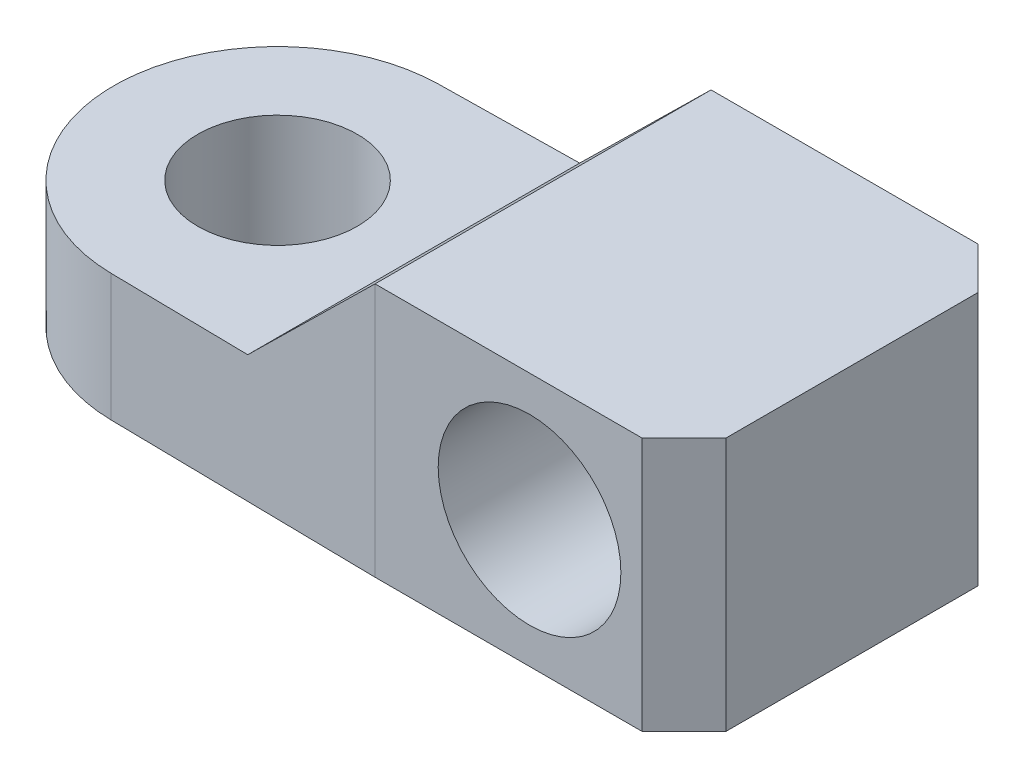
ISO-10303-21;
HEADER;
FILE_DESCRIPTION(('STEP AP214'),'2;1');
FILE_NAME('part.step','',(''),(''),'','','');
FILE_SCHEMA(('AUTOMOTIVE_DESIGN { 1 0 10303 214 1 1 1 1 }'));
ENDSEC;
DATA;
#1=APPLICATION_CONTEXT('core data for automotive mechanical design processes');
#2=APPLICATION_PROTOCOL_DEFINITION('international standard','automotive_design',2000,#1);
#3=PRODUCT_CONTEXT('',#1,'mechanical');
#4=PRODUCT('Part','Part','',(#3));
#5=PRODUCT_RELATED_PRODUCT_CATEGORY('part','',(#4));
#6=PRODUCT_DEFINITION_FORMATION('','',#4);
#7=PRODUCT_DEFINITION_CONTEXT('part definition',#1,'design');
#8=PRODUCT_DEFINITION('design','',#6,#7);
#9=PRODUCT_DEFINITION_SHAPE('','',#8);
#10=(LENGTH_UNIT() NAMED_UNIT(*) SI_UNIT(.MILLI.,.METRE.));
#11=(NAMED_UNIT(*) PLANE_ANGLE_UNIT() SI_UNIT($,.RADIAN.));
#12=(NAMED_UNIT(*) SI_UNIT($,.STERADIAN.) SOLID_ANGLE_UNIT());
#13=UNCERTAINTY_MEASURE_WITH_UNIT(LENGTH_MEASURE(1.E-05),#10,'distance_accuracy_value','');
#14=(GEOMETRIC_REPRESENTATION_CONTEXT(3) GLOBAL_UNCERTAINTY_ASSIGNED_CONTEXT((#13)) GLOBAL_UNIT_ASSIGNED_CONTEXT((#10,
#11,#12)) REPRESENTATION_CONTEXT('',''));
#15=CARTESIAN_POINT('',(0.,0.,0.));
#16=DIRECTION('',(0.,0.,1.));
#17=DIRECTION('',(1.,0.,0.));
#18=AXIS2_PLACEMENT_3D('',#15,#16,#17);
#19=CARTESIAN_POINT('',(-0.0613838784445087,6.05,-3.89951689565093));
#20=DIRECTION('',(-0.0157394560114125,0.,-0.999876127089983));
#21=DIRECTION('',(-0.999876127089984,0.,0.0157394560114125));
#22=AXIS2_PLACEMENT_3D('',#19,#20,#21);
#23=PLANE('',#22);
#24=DIRECTION('',(0.,-1.,0.));
#25=VECTOR('',#24,1.);
#26=CARTESIAN_POINT('',(-0.0613838784445082,6.05,-3.89951689565093));
#27=LINE('',#26,#25);
#28=CARTESIAN_POINT('',(-0.0613838784445082,3.025,-3.89951689565093));
#29=VERTEX_POINT('',#28);
#30=CARTESIAN_POINT('',(-0.0613838784445082,0.,-3.89951689565093));
#31=VERTEX_POINT('',#30);
#32=EDGE_CURVE('E179',#29,#31,#27,.T.);
#33=ORIENTED_EDGE('',*,*,#32,.F.);
#34=DIRECTION('',(0.999876127089984,0.,-0.0157394560114125));
#35=VECTOR('',#34,1.);
#36=CARTESIAN_POINT('',(-0.0613838784445087,3.025,-3.89951689565093));
#37=LINE('',#36,#35);
#38=CARTESIAN_POINT('',(3.2418601585521,3.025,-3.95151460097328));
#39=VERTEX_POINT('',#38);
#40=EDGE_CURVE('E141',#29,#39,#37,.T.);
#41=ORIENTED_EDGE('',*,*,#40,.T.);
#42=DIRECTION('',(0.713416670590464,0.700650081816092,-0.0112301814198194));
#43=VECTOR('',#42,1.);
#44=CARTESIAN_POINT('',(3.07227615816136,2.85845070469108,-3.94884511038132));
#45=LINE('',#44,#43);
#46=CARTESIAN_POINT('',(6.32197887193665,6.05,-3.99999999999999));
#47=VERTEX_POINT('',#46);
#48=EDGE_CURVE('E130',#39,#47,#45,.T.);
#49=ORIENTED_EDGE('',*,*,#48,.T.);
#50=DIRECTION('',(0.,-1.,0.));
#51=VECTOR('',#50,1.);
#52=CARTESIAN_POINT('',(6.32197887193665,6.05,-3.99999999999999));
#53=LINE('',#52,#51);
#54=CARTESIAN_POINT('',(6.32197887193665,0.,-3.99999999999999));
#55=VERTEX_POINT('',#54);
#56=EDGE_CURVE('E156',#47,#55,#53,.T.);
#57=ORIENTED_EDGE('',*,*,#56,.T.);
#58=DIRECTION('',(0.999876127089984,0.,-0.0157394560114125));
#59=VECTOR('',#58,1.);
#60=CARTESIAN_POINT('',(-0.0613838784445087,0.,-3.89951689565093));
#61=LINE('',#60,#59);
#62=EDGE_CURVE('E159',#31,#55,#61,.T.);
#63=ORIENTED_EDGE('',*,*,#62,.F.);
#64=EDGE_LOOP('',(#33,#41,#49,#57,#63));
#65=FACE_BOUND('',#64,.T.);
#66=ADVANCED_FACE('F38',(#65),#23,.T.);
#67=CARTESIAN_POINT('',(0.,6.05,0.));
#68=DIRECTION('',(0.,-1.,0.));
#69=DIRECTION('',(0.,0.,-1.));
#70=AXIS2_PLACEMENT_3D('',#67,#68,#69);
#71=CYLINDRICAL_SURFACE('',#70,3.9);
#72=CARTESIAN_POINT('',(0.,3.025,0.));
#73=DIRECTION('',(0.,1.,0.));
#74=DIRECTION('',(0.,0.,1.));
#75=AXIS2_PLACEMENT_3D('',#72,#73,#74);
#76=CIRCLE('',#75,3.9);
#77=CARTESIAN_POINT('',(-0.0613838784445082,3.025,3.89951689565094));
#78=VERTEX_POINT('',#77);
#79=EDGE_CURVE('E121',#29,#78,#76,.T.);
#80=ORIENTED_EDGE('',*,*,#79,.F.);
#81=ORIENTED_EDGE('',*,*,#32,.T.);
#82=CARTESIAN_POINT('',(0.,0.,0.));
#83=DIRECTION('',(0.,1.,0.));
#84=DIRECTION('',(0.,0.,1.));
#85=AXIS2_PLACEMENT_3D('',#82,#83,#84);
#86=CIRCLE('',#85,3.9);
#87=CARTESIAN_POINT('',(-0.0613838784445082,0.,3.89951689565094));
#88=VERTEX_POINT('',#87);
#89=EDGE_CURVE('E162',#31,#88,#86,.T.);
#90=ORIENTED_EDGE('',*,*,#89,.T.);
#91=DIRECTION('',(0.,-1.,0.));
#92=VECTOR('',#91,1.);
#93=CARTESIAN_POINT('',(-0.0613838784445082,6.05,3.89951689565094));
#94=LINE('',#93,#92);
#95=EDGE_CURVE('E177',#78,#88,#94,.T.);
#96=ORIENTED_EDGE('',*,*,#95,.F.);
#97=EDGE_LOOP('',(#80,#81,#90,#96));
#98=FACE_BOUND('',#97,.T.);
#99=ADVANCED_FACE('F228',(#98),#71,.T.);
#100=CARTESIAN_POINT('',(-0.0613838784445087,6.05,3.89951689565094));
#101=DIRECTION('',(-0.0157394560114125,0.,0.999876127089983));
#102=DIRECTION('',(0.999876127089984,0.,0.0157394560114125));
#103=AXIS2_PLACEMENT_3D('',#100,#101,#102);
#104=PLANE('',#103);
#105=DIRECTION('',(-0.713416670590464,-0.700650081816092,-0.0112301814198194));
#106=VECTOR('',#105,1.);
#107=CARTESIAN_POINT('',(3.07227615816136,2.85845070469108,3.94884511038132));
#108=LINE('',#107,#106);
#109=CARTESIAN_POINT('',(6.32197887193665,6.05,3.99999999999999));
#110=VERTEX_POINT('',#109);
#111=CARTESIAN_POINT('',(3.2418601585521,3.025,3.95151460097328));
#112=VERTEX_POINT('',#111);
#113=EDGE_CURVE('E128',#110,#112,#108,.T.);
#114=ORIENTED_EDGE('',*,*,#113,.T.);
#115=DIRECTION('',(-0.999876127089984,0.,-0.0157394560114125));
#116=VECTOR('',#115,1.);
#117=CARTESIAN_POINT('',(-0.0613838784445087,3.025,3.89951689565094));
#118=LINE('',#117,#116);
#119=EDGE_CURVE('E115',#112,#78,#118,.T.);
#120=ORIENTED_EDGE('',*,*,#119,.T.);
#121=ORIENTED_EDGE('',*,*,#95,.T.);
#122=DIRECTION('',(-0.999876127089984,0.,-0.0157394560114125));
#123=VECTOR('',#122,1.);
#124=CARTESIAN_POINT('',(-0.0613838784445087,0.,3.89951689565094));
#125=LINE('',#124,#123);
#126=CARTESIAN_POINT('',(6.32197887193665,0.,3.99999999999999));
#127=VERTEX_POINT('',#126);
#128=EDGE_CURVE('E165',#127,#88,#125,.T.);
#129=ORIENTED_EDGE('',*,*,#128,.F.);
#130=DIRECTION('',(0.,-1.,0.));
#131=VECTOR('',#130,1.);
#132=CARTESIAN_POINT('',(6.32197887193665,6.05,3.99999999999999));
#133=LINE('',#132,#131);
#134=EDGE_CURVE('E136',#110,#127,#133,.T.);
#135=ORIENTED_EDGE('',*,*,#134,.F.);
#136=EDGE_LOOP('',(#114,#120,#121,#129,#135));
#137=FACE_BOUND('',#136,.T.);
#138=ADVANCED_FACE('F133',(#137),#104,.T.);
#139=CARTESIAN_POINT('',(0.,6.05,0.));
#140=DIRECTION('',(0.,-1.,0.));
#141=DIRECTION('',(0.,0.,-1.));
#142=AXIS2_PLACEMENT_3D('',#139,#140,#141);
#143=CYLINDRICAL_SURFACE('',#142,1.9);
#144=CARTESIAN_POINT('',(0.,0.,0.));
#145=DIRECTION('',(0.,1.,0.));
#146=DIRECTION('',(0.,0.,1.));
#147=AXIS2_PLACEMENT_3D('',#144,#145,#146);
#148=CIRCLE('',#147,1.9);
#149=CARTESIAN_POINT('',(0.,0.,1.9));
#150=VERTEX_POINT('',#149);
#151=EDGE_CURVE('E147',#150,#150,#148,.T.);
#152=ORIENTED_EDGE('',*,*,#151,.F.);
#153=EDGE_LOOP('',(#152));
#154=FACE_BOUND('',#153,.T.);
#155=CARTESIAN_POINT('',(0.,3.025,0.));
#156=DIRECTION('',(0.,1.,0.));
#157=DIRECTION('',(0.,0.,1.));
#158=AXIS2_PLACEMENT_3D('',#155,#156,#157);
#159=CIRCLE('',#158,1.9);
#160=CARTESIAN_POINT('',(0.,3.025,1.9));
#161=VERTEX_POINT('',#160);
#162=EDGE_CURVE('E43',#161,#161,#159,.T.);
#163=ORIENTED_EDGE('',*,*,#162,.T.);
#164=EDGE_LOOP('',(#163));
#165=FACE_BOUND('',#164,.T.);
#166=ADVANCED_FACE('F237',(#154,#165),#143,.F.);
#167=CARTESIAN_POINT('',(0.,6.05,0.));
#168=DIRECTION('',(0.,1.,0.));
#169=DIRECTION('',(0.,0.,1.));
#170=AXIS2_PLACEMENT_3D('',#167,#168,#169);
#171=PLANE('',#170);
#172=DIRECTION('',(1.,0.,0.));
#173=VECTOR('',#172,1.);
#174=CARTESIAN_POINT('',(0.,6.05,-3.99999999999999));
#175=LINE('',#174,#173);
#176=CARTESIAN_POINT('',(12.6780211280634,6.05,-3.99999999999999));
#177=VERTEX_POINT('',#176);
#178=EDGE_CURVE('E154',#47,#177,#175,.T.);
#179=ORIENTED_EDGE('',*,*,#178,.F.);
#180=DIRECTION('',(0.,0.,1.));
#181=VECTOR('',#180,1.);
#182=CARTESIAN_POINT('',(6.32197887193664,6.05,0.));
#183=LINE('',#182,#181);
#184=EDGE_CURVE('E11',#47,#110,#183,.T.);
#185=ORIENTED_EDGE('',*,*,#184,.T.);
#186=DIRECTION('',(-1.,0.,0.));
#187=VECTOR('',#186,1.);
#188=CARTESIAN_POINT('',(0.,6.05,3.99999999999998));
#189=LINE('',#188,#187);
#190=CARTESIAN_POINT('',(12.6780211280633,6.05,4.00000000000001));
#191=VERTEX_POINT('',#190);
#192=EDGE_CURVE('E148',#191,#110,#189,.T.);
#193=ORIENTED_EDGE('',*,*,#192,.F.);
#194=DIRECTION('',(-0.707106781186551,0.,0.707106781186544));
#195=VECTOR('',#194,1.);
#196=CARTESIAN_POINT('',(8.33901056403162,6.05,8.3390105640317));
#197=LINE('',#196,#195);
#198=CARTESIAN_POINT('',(13.6780211280634,6.05,3.00000000000001));
#199=VERTEX_POINT('',#198);
#200=EDGE_CURVE('E194',#191,#199,#197,.F.);
#201=ORIENTED_EDGE('',*,*,#200,.T.);
#202=DIRECTION('',(0.,0.,1.));
#203=VECTOR('',#202,1.);
#204=CARTESIAN_POINT('',(13.6780211280634,6.05,0.));
#205=LINE('',#204,#203);
#206=CARTESIAN_POINT('',(13.6780211280634,6.05,-2.99999999999999));
#207=VERTEX_POINT('',#206);
#208=EDGE_CURVE('E150',#207,#199,#205,.T.);
#209=ORIENTED_EDGE('',*,*,#208,.F.);
#210=DIRECTION('',(0.707106781186546,0.,0.707106781186549));
#211=VECTOR('',#210,1.);
#212=CARTESIAN_POINT('',(8.33901056403169,6.05,-8.33901056403167));
#213=LINE('',#212,#211);
#214=EDGE_CURVE('E55',#207,#177,#213,.F.);
#215=ORIENTED_EDGE('',*,*,#214,.T.);
#216=EDGE_LOOP('',(#179,#185,#193,#201,#209,#215));
#217=FACE_BOUND('',#216,.T.);
#218=ADVANCED_FACE('F210',(#217),#171,.T.);
#219=CARTESIAN_POINT('',(0.,6.05,3.99999999999998));
#220=DIRECTION('',(0.,0.,1.));
#221=DIRECTION('',(1.,0.,0.));
#222=AXIS2_PLACEMENT_3D('',#219,#220,#221);
#223=PLANE('',#222);
#224=CARTESIAN_POINT('',(10.,3.025,4.));
#225=DIRECTION('',(0.,0.,1.));
#226=DIRECTION('',(1.,0.,0.));
#227=AXIS2_PLACEMENT_3D('',#224,#225,#226);
#228=CIRCLE('',#227,2.175);
#229=CARTESIAN_POINT('',(12.175,3.025,4.00000000000001));
#230=VERTEX_POINT('',#229);
#231=EDGE_CURVE('E144',#230,#230,#228,.F.);
#232=ORIENTED_EDGE('',*,*,#231,.T.);
#233=EDGE_LOOP('',(#232));
#234=FACE_BOUND('',#233,.T.);
#235=DIRECTION('',(-1.,0.,0.));
#236=VECTOR('',#235,1.);
#237=CARTESIAN_POINT('',(0.,0.,3.99999999999998));
#238=LINE('',#237,#236);
#239=CARTESIAN_POINT('',(12.6780211280633,0.,4.00000000000001));
#240=VERTEX_POINT('',#239);
#241=EDGE_CURVE('E168',#240,#127,#238,.T.);
#242=ORIENTED_EDGE('',*,*,#241,.F.);
#243=DIRECTION('',(0.,1.,0.));
#244=VECTOR('',#243,1.);
#245=CARTESIAN_POINT('',(12.6780211280633,6.05,4.00000000000001));
#246=LINE('',#245,#244);
#247=EDGE_CURVE('E63',#240,#191,#246,.T.);
#248=ORIENTED_EDGE('',*,*,#247,.T.);
#249=ORIENTED_EDGE('',*,*,#192,.T.);
#250=ORIENTED_EDGE('',*,*,#134,.T.);
#251=EDGE_LOOP('',(#242,#248,#249,#250));
#252=FACE_BOUND('',#251,.T.);
#253=ADVANCED_FACE('F212',(#234,#252),#223,.T.);
#254=CARTESIAN_POINT('',(13.6780211280634,6.05,0.));
#255=DIRECTION('',(1.,0.,0.));
#256=DIRECTION('',(0.,0.,-1.));
#257=AXIS2_PLACEMENT_3D('',#254,#255,#256);
#258=PLANE('',#257);
#259=ORIENTED_EDGE('',*,*,#208,.T.);
#260=DIRECTION('',(0.,-1.,0.));
#261=VECTOR('',#260,1.);
#262=CARTESIAN_POINT('',(13.6780211280634,6.05,3.00000000000001));
#263=LINE('',#262,#261);
#264=CARTESIAN_POINT('',(13.6780211280634,0.,3.00000000000001));
#265=VERTEX_POINT('',#264);
#266=EDGE_CURVE('E185',#199,#265,#263,.T.);
#267=ORIENTED_EDGE('',*,*,#266,.T.);
#268=DIRECTION('',(0.,0.,1.));
#269=VECTOR('',#268,1.);
#270=CARTESIAN_POINT('',(13.6780211280634,0.,0.));
#271=LINE('',#270,#269);
#272=CARTESIAN_POINT('',(13.6780211280634,0.,-2.99999999999999));
#273=VERTEX_POINT('',#272);
#274=EDGE_CURVE('E170',#273,#265,#271,.T.);
#275=ORIENTED_EDGE('',*,*,#274,.F.);
#276=DIRECTION('',(0.,1.,0.));
#277=VECTOR('',#276,1.);
#278=CARTESIAN_POINT('',(13.6780211280634,6.05,-2.99999999999999));
#279=LINE('',#278,#277);
#280=EDGE_CURVE('E181',#273,#207,#279,.T.);
#281=ORIENTED_EDGE('',*,*,#280,.T.);
#282=EDGE_LOOP('',(#259,#267,#275,#281));
#283=FACE_BOUND('',#282,.T.);
#284=ADVANCED_FACE('F217',(#283),#258,.T.);
#285=CARTESIAN_POINT('',(0.,6.05,-3.99999999999999));
#286=DIRECTION('',(0.,0.,-1.));
#287=DIRECTION('',(-1.,0.,0.));
#288=AXIS2_PLACEMENT_3D('',#285,#286,#287);
#289=PLANE('',#288);
#290=CARTESIAN_POINT('',(10.,3.025,-3.99999999999999));
#291=DIRECTION('',(0.,0.,-1.));
#292=DIRECTION('',(-1.,0.,0.));
#293=AXIS2_PLACEMENT_3D('',#290,#291,#292);
#294=CIRCLE('',#293,2.175);
#295=CARTESIAN_POINT('',(7.825,3.025,-3.99999999999999));
#296=VERTEX_POINT('',#295);
#297=EDGE_CURVE('E143',#296,#296,#294,.F.);
#298=ORIENTED_EDGE('',*,*,#297,.T.);
#299=EDGE_LOOP('',(#298));
#300=FACE_BOUND('',#299,.T.);
#301=ORIENTED_EDGE('',*,*,#178,.T.);
#302=DIRECTION('',(0.,-1.,0.));
#303=VECTOR('',#302,1.);
#304=CARTESIAN_POINT('',(12.6780211280634,6.05,-3.99999999999999));
#305=LINE('',#304,#303);
#306=CARTESIAN_POINT('',(12.6780211280634,0.,-3.99999999999999));
#307=VERTEX_POINT('',#306);
#308=EDGE_CURVE('E48',#177,#307,#305,.T.);
#309=ORIENTED_EDGE('',*,*,#308,.T.);
#310=DIRECTION('',(1.,0.,0.));
#311=VECTOR('',#310,1.);
#312=CARTESIAN_POINT('',(0.,0.,-3.99999999999999));
#313=LINE('',#312,#311);
#314=EDGE_CURVE('E151',#55,#307,#313,.T.);
#315=ORIENTED_EDGE('',*,*,#314,.F.);
#316=ORIENTED_EDGE('',*,*,#56,.F.);
#317=EDGE_LOOP('',(#301,#309,#315,#316));
#318=FACE_BOUND('',#317,.T.);
#319=ADVANCED_FACE('F200',(#300,#318),#289,.T.);
#320=CARTESIAN_POINT('',(0.,0.,0.));
#321=DIRECTION('',(0.,1.,0.));
#322=DIRECTION('',(0.,0.,1.));
#323=AXIS2_PLACEMENT_3D('',#320,#321,#322);
#324=PLANE('',#323);
#325=ORIENTED_EDGE('',*,*,#151,.T.);
#326=EDGE_LOOP('',(#325));
#327=FACE_BOUND('',#326,.T.);
#328=ORIENTED_EDGE('',*,*,#274,.T.);
#329=DIRECTION('',(0.707106781186551,0.,-0.707106781186544));
#330=VECTOR('',#329,1.);
#331=CARTESIAN_POINT('',(13.6780211280634,0.,3.00000000000001));
#332=LINE('',#331,#330);
#333=EDGE_CURVE('E190',#265,#240,#332,.F.);
#334=ORIENTED_EDGE('',*,*,#333,.T.);
#335=ORIENTED_EDGE('',*,*,#241,.T.);
#336=ORIENTED_EDGE('',*,*,#128,.T.);
#337=ORIENTED_EDGE('',*,*,#89,.F.);
#338=ORIENTED_EDGE('',*,*,#62,.T.);
#339=ORIENTED_EDGE('',*,*,#314,.T.);
#340=DIRECTION('',(-0.707106781186546,0.,-0.707106781186549));
#341=VECTOR('',#340,1.);
#342=CARTESIAN_POINT('',(12.6780211280634,0.,-3.99999999999999));
#343=LINE('',#342,#341);
#344=EDGE_CURVE('E188',#307,#273,#343,.F.);
#345=ORIENTED_EDGE('',*,*,#344,.T.);
#346=EDGE_LOOP('',(#328,#334,#335,#336,#337,#338,#339,#345));
#347=FACE_BOUND('',#346,.T.);
#348=ADVANCED_FACE('F204',(#327,#347),#324,.F.);
#349=CARTESIAN_POINT('',(10.,3.025,19.));
#350=DIRECTION('',(0.,0.,-1.));
#351=DIRECTION('',(-1.,0.,0.));
#352=AXIS2_PLACEMENT_3D('',#349,#350,#351);
#353=CYLINDRICAL_SURFACE('',#352,2.175);
#354=ORIENTED_EDGE('',*,*,#231,.F.);
#355=EDGE_LOOP('',(#354));
#356=FACE_BOUND('',#355,.T.);
#357=ORIENTED_EDGE('',*,*,#297,.F.);
#358=EDGE_LOOP('',(#357));
#359=FACE_BOUND('',#358,.T.);
#360=ADVANCED_FACE('F226',(#356,#359),#353,.F.);
#361=CARTESIAN_POINT('',(13.6780211280634,6.05,3.00000000000001));
#362=DIRECTION('',(-0.707106781186544,0.,-0.70710678118655));
#363=DIRECTION('',(0.,-1.,0.));
#364=AXIS2_PLACEMENT_3D('',#361,#362,#363);
#365=PLANE('',#364);
#366=ORIENTED_EDGE('',*,*,#200,.F.);
#367=ORIENTED_EDGE('',*,*,#247,.F.);
#368=ORIENTED_EDGE('',*,*,#333,.F.);
#369=ORIENTED_EDGE('',*,*,#266,.F.);
#370=EDGE_LOOP('',(#366,#367,#368,#369));
#371=FACE_BOUND('',#370,.T.);
#372=ADVANCED_FACE('F215',(#371),#365,.F.);
#373=CARTESIAN_POINT('',(12.6780211280634,6.05,-3.99999999999999));
#374=DIRECTION('',(-0.707106781186549,0.,0.707106781186546));
#375=DIRECTION('',(0.,-1.,0.));
#376=AXIS2_PLACEMENT_3D('',#373,#374,#375);
#377=PLANE('',#376);
#378=ORIENTED_EDGE('',*,*,#214,.F.);
#379=ORIENTED_EDGE('',*,*,#280,.F.);
#380=ORIENTED_EDGE('',*,*,#344,.F.);
#381=ORIENTED_EDGE('',*,*,#308,.F.);
#382=EDGE_LOOP('',(#378,#379,#380,#381));
#383=FACE_BOUND('',#382,.T.);
#384=ADVANCED_FACE('F41',(#383),#377,.F.);
#385=CARTESIAN_POINT('',(-3.9,3.025,10.));
#386=DIRECTION('',(0.,1.,0.));
#387=DIRECTION('',(0.,0.,1.));
#388=AXIS2_PLACEMENT_3D('',#385,#386,#387);
#389=PLANE('',#388);
#390=ORIENTED_EDGE('',*,*,#162,.F.);
#391=EDGE_LOOP('',(#390));
#392=FACE_BOUND('',#391,.T.);
#393=ORIENTED_EDGE('',*,*,#79,.T.);
#394=ORIENTED_EDGE('',*,*,#119,.F.);
#395=DIRECTION('',(0.,0.,-1.));
#396=VECTOR('',#395,1.);
#397=CARTESIAN_POINT('',(3.2418601585521,3.025,10.));
#398=LINE('',#397,#396);
#399=EDGE_CURVE('E118',#112,#39,#398,.T.);
#400=ORIENTED_EDGE('',*,*,#399,.T.);
#401=ORIENTED_EDGE('',*,*,#40,.F.);
#402=EDGE_LOOP('',(#393,#394,#400,#401));
#403=FACE_BOUND('',#402,.T.);
#404=ADVANCED_FACE('F117',(#392,#403),#389,.T.);
#405=CARTESIAN_POINT('',(3.2418601585521,3.025,10.));
#406=DIRECTION('',(-0.700694267929928,0.713461661822232,0.));
#407=DIRECTION('',(-0.713461661822233,-0.700694267929929,0.));
#408=AXIS2_PLACEMENT_3D('',#405,#406,#407);
#409=PLANE('',#408);
#410=ORIENTED_EDGE('',*,*,#399,.F.);
#411=ORIENTED_EDGE('',*,*,#113,.F.);
#412=ORIENTED_EDGE('',*,*,#184,.F.);
#413=ORIENTED_EDGE('',*,*,#48,.F.);
#414=EDGE_LOOP('',(#410,#411,#412,#413));
#415=FACE_BOUND('',#414,.T.);
#416=ADVANCED_FACE('F127',(#415),#409,.T.);
#417=CLOSED_SHELL('',(#66,#99,#138,#166,#218,#253,#284,#319,#348,#360,#372,#384,#404,#416));
#418=MANIFOLD_SOLID_BREP('B2',#417);
#419=ADVANCED_BREP_SHAPE_REPRESENTATION('',(#18,#418),#14);
#420=SHAPE_DEFINITION_REPRESENTATION(#9,#419);
ENDSEC;
END-ISO-10303-21;
